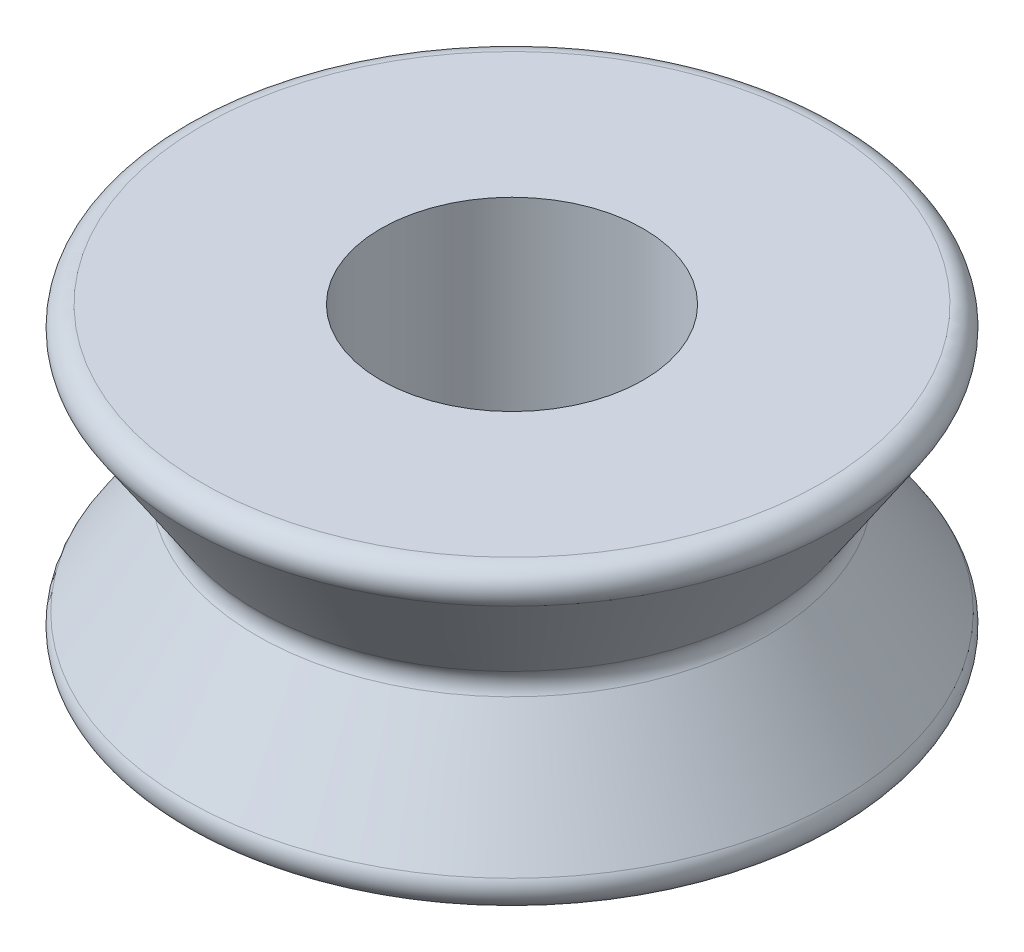
ISO-10303-21;
HEADER;
FILE_DESCRIPTION(('STEP AP214'),'2;1');
FILE_NAME('part.step','',(''),(''),'','','');
FILE_SCHEMA(('AUTOMOTIVE_DESIGN { 1 0 10303 214 1 1 1 1 }'));
ENDSEC;
DATA;
#1=APPLICATION_CONTEXT('core data for automotive mechanical design processes');
#2=APPLICATION_PROTOCOL_DEFINITION('international standard','automotive_design',2000,#1);
#3=PRODUCT_CONTEXT('',#1,'mechanical');
#4=PRODUCT('Part','Part','',(#3));
#5=PRODUCT_RELATED_PRODUCT_CATEGORY('part','',(#4));
#6=PRODUCT_DEFINITION_FORMATION('','',#4);
#7=PRODUCT_DEFINITION_CONTEXT('part definition',#1,'design');
#8=PRODUCT_DEFINITION('design','',#6,#7);
#9=PRODUCT_DEFINITION_SHAPE('','',#8);
#10=(LENGTH_UNIT() NAMED_UNIT(*) SI_UNIT(.MILLI.,.METRE.));
#11=(NAMED_UNIT(*) PLANE_ANGLE_UNIT() SI_UNIT($,.RADIAN.));
#12=(NAMED_UNIT(*) SI_UNIT($,.STERADIAN.) SOLID_ANGLE_UNIT());
#13=UNCERTAINTY_MEASURE_WITH_UNIT(LENGTH_MEASURE(1.E-05),#10,'distance_accuracy_value','');
#14=(GEOMETRIC_REPRESENTATION_CONTEXT(3) GLOBAL_UNCERTAINTY_ASSIGNED_CONTEXT((#13)) GLOBAL_UNIT_ASSIGNED_CONTEXT((#10,
#11,#12)) REPRESENTATION_CONTEXT('',''));
#15=CARTESIAN_POINT('',(0.,0.,0.));
#16=DIRECTION('',(0.,0.,1.));
#17=DIRECTION('',(1.,0.,0.));
#18=AXIS2_PLACEMENT_3D('',#15,#16,#17);
#19=CARTESIAN_POINT('',(-7.,3.,0.));
#20=DIRECTION('',(0.,1.,0.));
#21=DIRECTION('',(-1.,0.,0.));
#22=AXIS2_PLACEMENT_3D('',#19,#20,#21);
#23=PLANE('',#22);
#24=CARTESIAN_POINT('',(0.,3.,0.));
#25=DIRECTION('',(0.,1.,0.));
#26=DIRECTION('',(0.,0.,1.));
#27=AXIS2_PLACEMENT_3D('',#24,#25,#26);
#28=CIRCLE('',#27,2.65);
#29=CARTESIAN_POINT('',(0.,3.,2.65));
#30=VERTEX_POINT('',#29);
#31=EDGE_CURVE('E70',#30,#30,#28,.T.);
#32=ORIENTED_EDGE('',*,*,#31,.F.);
#33=EDGE_LOOP('',(#32));
#34=FACE_BOUND('',#33,.T.);
#35=CARTESIAN_POINT('',(0.,3.,0.));
#36=DIRECTION('',(0.,1.,0.));
#37=DIRECTION('',(-1.,0.,0.));
#38=AXIS2_PLACEMENT_3D('',#35,#36,#37);
#39=CIRCLE('',#38,6.25259316327147);
#40=CARTESIAN_POINT('',(-6.25259316327147,3.,0.));
#41=VERTEX_POINT('',#40);
#42=EDGE_CURVE('E63',#41,#41,#39,.T.);
#43=ORIENTED_EDGE('',*,*,#42,.T.);
#44=EDGE_LOOP('',(#43));
#45=FACE_BOUND('',#44,.T.);
#46=ADVANCED_FACE('F34',(#34,#45),#23,.T.);
#47=CARTESIAN_POINT('',(-7.,-3.,0.));
#48=DIRECTION('',(0.,-1.,0.));
#49=DIRECTION('',(1.,0.,0.));
#50=AXIS2_PLACEMENT_3D('',#47,#48,#49);
#51=PLANE('',#50);
#52=CARTESIAN_POINT('',(0.,-3.00000000000001,0.));
#53=DIRECTION('',(0.,1.,0.));
#54=DIRECTION('',(0.,0.,1.));
#55=AXIS2_PLACEMENT_3D('',#52,#53,#54);
#56=CIRCLE('',#55,2.65);
#57=CARTESIAN_POINT('',(0.,-3.00000000000001,2.65));
#58=VERTEX_POINT('',#57);
#59=EDGE_CURVE('E67',#58,#58,#56,.T.);
#60=ORIENTED_EDGE('',*,*,#59,.T.);
#61=EDGE_LOOP('',(#60));
#62=FACE_BOUND('',#61,.T.);
#63=CARTESIAN_POINT('',(0.,-3.,0.));
#64=DIRECTION('',(0.,-1.,0.));
#65=DIRECTION('',(1.,0.,0.));
#66=AXIS2_PLACEMENT_3D('',#63,#64,#65);
#67=CIRCLE('',#66,6.25259316327147);
#68=CARTESIAN_POINT('',(6.25259316327147,-3.,0.));
#69=VERTEX_POINT('',#68);
#70=EDGE_CURVE('E10',#69,#69,#67,.T.);
#71=ORIENTED_EDGE('',*,*,#70,.T.);
#72=EDGE_LOOP('',(#71));
#73=FACE_BOUND('',#72,.T.);
#74=ADVANCED_FACE('F79',(#62,#73),#51,.T.);
#75=CARTESIAN_POINT('',(0.,0.,0.));
#76=DIRECTION('',(0.,-1.,0.));
#77=DIRECTION('',(1.,0.,0.));
#78=AXIS2_PLACEMENT_3D('',#75,#76,#77);
#79=CONICAL_SURFACE('',#78,5.,0.588002603547567);
#80=CARTESIAN_POINT('',(0.,-0.22188007849009,0.));
#81=DIRECTION('',(0.,-1.,0.));
#82=DIRECTION('',(1.,0.,0.));
#83=AXIS2_PLACEMENT_3D('',#80,#81,#82);
#84=CIRCLE('',#83,5.14792005232673);
#85=CARTESIAN_POINT('',(5.14792005232673,-0.221880078490089,0.));
#86=VERTEX_POINT('',#85);
#87=EDGE_CURVE('E42',#86,#86,#84,.T.);
#88=ORIENTED_EDGE('',*,*,#87,.T.);
#89=EDGE_LOOP('',(#88));
#90=FACE_BOUND('',#89,.T.);
#91=CARTESIAN_POINT('',(0.,-2.37811992150991,0.));
#92=DIRECTION('',(0.,1.,0.));
#93=DIRECTION('',(-1.,0.,0.));
#94=AXIS2_PLACEMENT_3D('',#91,#92,#93);
#95=CIRCLE('',#94,6.58541328100661);
#96=CARTESIAN_POINT('',(-6.58541328100661,-2.37811992150991,0.));
#97=VERTEX_POINT('',#96);
#98=EDGE_CURVE('E49',#97,#97,#95,.T.);
#99=ORIENTED_EDGE('',*,*,#98,.T.);
#100=EDGE_LOOP('',(#99));
#101=FACE_BOUND('',#100,.T.);
#102=ADVANCED_FACE('F94',(#90,#101),#79,.T.);
#103=CARTESIAN_POINT('',(0.,3.,0.));
#104=DIRECTION('',(0.,1.,0.));
#105=DIRECTION('',(-1.,0.,0.));
#106=AXIS2_PLACEMENT_3D('',#103,#104,#105);
#107=CONICAL_SURFACE('',#106,7.,0.588002603547568);
#108=CARTESIAN_POINT('',(0.,2.37811992150991,0.));
#109=DIRECTION('',(0.,-1.,0.));
#110=DIRECTION('',(1.,0.,0.));
#111=AXIS2_PLACEMENT_3D('',#108,#109,#110);
#112=CIRCLE('',#111,6.58541328100661);
#113=CARTESIAN_POINT('',(6.5854132810066,2.37811992150991,0.));
#114=VERTEX_POINT('',#113);
#115=EDGE_CURVE('E54',#114,#114,#112,.T.);
#116=ORIENTED_EDGE('',*,*,#115,.T.);
#117=EDGE_LOOP('',(#116));
#118=FACE_BOUND('',#117,.T.);
#119=CARTESIAN_POINT('',(0.,0.221880078490093,0.));
#120=DIRECTION('',(0.,1.,0.));
#121=DIRECTION('',(-1.,0.,0.));
#122=AXIS2_PLACEMENT_3D('',#119,#120,#121);
#123=CIRCLE('',#122,5.14792005232673);
#124=CARTESIAN_POINT('',(-5.14792005232673,0.221880078490091,0.));
#125=VERTEX_POINT('',#124);
#126=EDGE_CURVE('E60',#125,#125,#123,.T.);
#127=ORIENTED_EDGE('',*,*,#126,.T.);
#128=EDGE_LOOP('',(#127));
#129=FACE_BOUND('',#128,.T.);
#130=ADVANCED_FACE('F86',(#118,#129),#107,.T.);
#131=CARTESIAN_POINT('',(0.,2.6,0.));
#132=DIRECTION('',(0.,1.,0.));
#133=DIRECTION('',(-1.,0.,0.));
#134=AXIS2_PLACEMENT_3D('',#131,#132,#133);
#135=TOROIDAL_SURFACE('',#134,6.25259316327147,0.4);
#136=ORIENTED_EDGE('',*,*,#115,.F.);
#137=EDGE_LOOP('',(#136));
#138=FACE_BOUND('',#137,.T.);
#139=ORIENTED_EDGE('',*,*,#42,.F.);
#140=EDGE_LOOP('',(#139));
#141=FACE_BOUND('',#140,.T.);
#142=ADVANCED_FACE('F83',(#138,#141),#135,.T.);
#143=CARTESIAN_POINT('',(0.,0.,0.));
#144=DIRECTION('',(0.,1.,0.));
#145=DIRECTION('',(-1.,0.,0.));
#146=AXIS2_PLACEMENT_3D('',#143,#144,#145);
#147=TOROIDAL_SURFACE('',#146,5.48074017006187,0.4);
#148=ORIENTED_EDGE('',*,*,#87,.F.);
#149=EDGE_LOOP('',(#148));
#150=FACE_BOUND('',#149,.T.);
#151=ORIENTED_EDGE('',*,*,#126,.F.);
#152=EDGE_LOOP('',(#151));
#153=FACE_BOUND('',#152,.T.);
#154=ADVANCED_FACE('F85',(#150,#153),#147,.F.);
#155=CARTESIAN_POINT('',(0.,-2.6,0.));
#156=DIRECTION('',(0.,-1.,0.));
#157=DIRECTION('',(1.,0.,0.));
#158=AXIS2_PLACEMENT_3D('',#155,#156,#157);
#159=TOROIDAL_SURFACE('',#158,6.25259316327147,0.4);
#160=ORIENTED_EDGE('',*,*,#70,.F.);
#161=EDGE_LOOP('',(#160));
#162=FACE_BOUND('',#161,.T.);
#163=ORIENTED_EDGE('',*,*,#98,.F.);
#164=EDGE_LOOP('',(#163));
#165=FACE_BOUND('',#164,.T.);
#166=ADVANCED_FACE('F36',(#162,#165),#159,.T.);
#167=CARTESIAN_POINT('',(0.,3.,0.));
#168=DIRECTION('',(0.,1.,0.));
#169=DIRECTION('',(0.,0.,1.));
#170=AXIS2_PLACEMENT_3D('',#167,#168,#169);
#171=CYLINDRICAL_SURFACE('',#170,2.65);
#172=ORIENTED_EDGE('',*,*,#59,.F.);
#173=EDGE_LOOP('',(#172));
#174=FACE_BOUND('',#173,.T.);
#175=ORIENTED_EDGE('',*,*,#31,.T.);
#176=EDGE_LOOP('',(#175));
#177=FACE_BOUND('',#176,.T.);
#178=ADVANCED_FACE('F75',(#174,#177),#171,.F.);
#179=CLOSED_SHELL('',(#46,#74,#102,#130,#142,#154,#166,#178));
#180=MANIFOLD_SOLID_BREP('B2',#179);
#181=ADVANCED_BREP_SHAPE_REPRESENTATION('',(#18,#180),#14);
#182=SHAPE_DEFINITION_REPRESENTATION(#9,#181);
ENDSEC;
END-ISO-10303-21;
